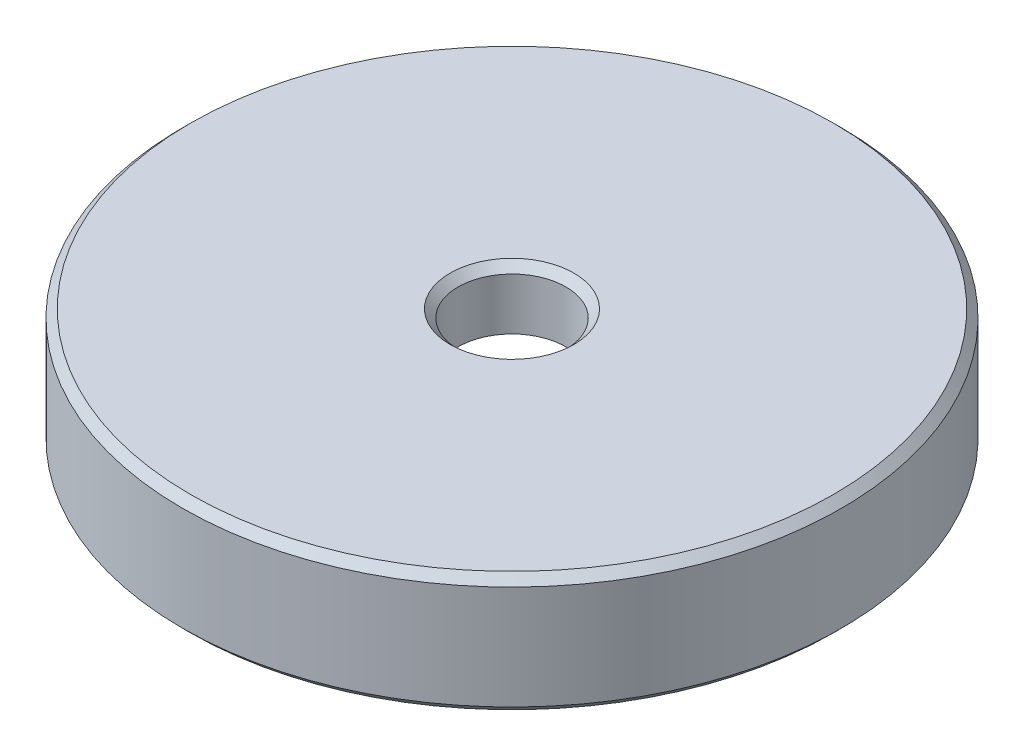
ISO-10303-21;
HEADER;
FILE_DESCRIPTION(('STEP AP214'),'2;1');
FILE_NAME('part.step','',(''),(''),'','','');
FILE_SCHEMA(('AUTOMOTIVE_DESIGN { 1 0 10303 214 1 1 1 1 }'));
ENDSEC;
DATA;
#1=APPLICATION_CONTEXT('core data for automotive mechanical design processes');
#2=APPLICATION_PROTOCOL_DEFINITION('international standard','automotive_design',2000,#1);
#3=PRODUCT_CONTEXT('',#1,'mechanical');
#4=PRODUCT('Part','Part','',(#3));
#5=PRODUCT_RELATED_PRODUCT_CATEGORY('part','',(#4));
#6=PRODUCT_DEFINITION_FORMATION('','',#4);
#7=PRODUCT_DEFINITION_CONTEXT('part definition',#1,'design');
#8=PRODUCT_DEFINITION('design','',#6,#7);
#9=PRODUCT_DEFINITION_SHAPE('','',#8);
#10=(LENGTH_UNIT() NAMED_UNIT(*) SI_UNIT(.MILLI.,.METRE.));
#11=(NAMED_UNIT(*) PLANE_ANGLE_UNIT() SI_UNIT($,.RADIAN.));
#12=(NAMED_UNIT(*) SI_UNIT($,.STERADIAN.) SOLID_ANGLE_UNIT());
#13=UNCERTAINTY_MEASURE_WITH_UNIT(LENGTH_MEASURE(1.E-05),#10,'distance_accuracy_value','');
#14=(GEOMETRIC_REPRESENTATION_CONTEXT(3) GLOBAL_UNCERTAINTY_ASSIGNED_CONTEXT((#13)) GLOBAL_UNIT_ASSIGNED_CONTEXT((#10,
#11,#12)) REPRESENTATION_CONTEXT('',''));
#15=CARTESIAN_POINT('',(0.,0.,0.));
#16=DIRECTION('',(0.,0.,1.));
#17=DIRECTION('',(1.,0.,0.));
#18=AXIS2_PLACEMENT_3D('',#15,#16,#17);
#19=CARTESIAN_POINT('',(0.,0.,0.));
#20=DIRECTION('',(0.,1.,0.));
#21=DIRECTION('',(0.,0.,1.));
#22=AXIS2_PLACEMENT_3D('',#19,#20,#21);
#23=PLANE('',#22);
#24=CARTESIAN_POINT('',(0.,0.,0.));
#25=DIRECTION('',(0.,1.,0.));
#26=DIRECTION('',(0.,0.,1.));
#27=AXIS2_PLACEMENT_3D('',#24,#25,#26);
#28=CIRCLE('',#27,2.7);
#29=CARTESIAN_POINT('',(0.,0.,2.7));
#30=VERTEX_POINT('',#29);
#31=EDGE_CURVE('E69',#30,#30,#28,.T.);
#32=ORIENTED_EDGE('',*,*,#31,.T.);
#33=EDGE_LOOP('',(#32));
#34=FACE_BOUND('',#33,.T.);
#35=CARTESIAN_POINT('',(0.,0.,0.));
#36=DIRECTION('',(0.,1.,0.));
#37=DIRECTION('',(0.,0.,1.));
#38=AXIS2_PLACEMENT_3D('',#35,#36,#37);
#39=CIRCLE('',#38,14.7);
#40=CARTESIAN_POINT('',(0.,0.,14.7));
#41=VERTEX_POINT('',#40);
#42=EDGE_CURVE('E66',#41,#41,#39,.T.);
#43=ORIENTED_EDGE('',*,*,#42,.F.);
#44=EDGE_LOOP('',(#43));
#45=FACE_BOUND('',#44,.T.);
#46=ADVANCED_FACE('F34',(#34,#45),#23,.F.);
#47=CARTESIAN_POINT('',(0.,3.,0.));
#48=DIRECTION('',(0.,-1.,0.));
#49=DIRECTION('',(0.,0.,-1.));
#50=AXIS2_PLACEMENT_3D('',#47,#48,#49);
#51=CYLINDRICAL_SURFACE('',#50,16.5);
#52=CARTESIAN_POINT('',(0.,-2.6,0.));
#53=DIRECTION('',(0.,1.,0.));
#54=DIRECTION('',(0.,0.,1.));
#55=AXIS2_PLACEMENT_3D('',#52,#53,#54);
#56=CIRCLE('',#55,16.5);
#57=CARTESIAN_POINT('',(0.,-2.6,16.5));
#58=VERTEX_POINT('',#57);
#59=EDGE_CURVE('E49',#58,#58,#56,.T.);
#60=ORIENTED_EDGE('',*,*,#59,.T.);
#61=EDGE_LOOP('',(#60));
#62=FACE_BOUND('',#61,.T.);
#63=CARTESIAN_POINT('',(0.,2.6,0.));
#64=DIRECTION('',(0.,1.,0.));
#65=DIRECTION('',(0.,0.,1.));
#66=AXIS2_PLACEMENT_3D('',#63,#64,#65);
#67=CIRCLE('',#66,16.5);
#68=CARTESIAN_POINT('',(0.,2.6,16.5));
#69=VERTEX_POINT('',#68);
#70=EDGE_CURVE('E54',#69,#69,#67,.F.);
#71=ORIENTED_EDGE('',*,*,#70,.T.);
#72=EDGE_LOOP('',(#71));
#73=FACE_BOUND('',#72,.T.);
#74=ADVANCED_FACE('F78',(#62,#73),#51,.T.);
#75=CARTESIAN_POINT('',(0.,3.,0.));
#76=DIRECTION('',(0.,-1.,0.));
#77=DIRECTION('',(0.,0.,-1.));
#78=AXIS2_PLACEMENT_3D('',#75,#76,#77);
#79=CYLINDRICAL_SURFACE('',#78,2.7);
#80=CARTESIAN_POINT('',(0.,2.59999999999999,0.));
#81=DIRECTION('',(0.,1.,0.));
#82=DIRECTION('',(0.,0.,1.));
#83=AXIS2_PLACEMENT_3D('',#80,#81,#82);
#84=CIRCLE('',#83,2.7);
#85=CARTESIAN_POINT('',(0.,2.59999999999999,2.7));
#86=VERTEX_POINT('',#85);
#87=EDGE_CURVE('E10',#86,#86,#84,.T.);
#88=ORIENTED_EDGE('',*,*,#87,.T.);
#89=EDGE_LOOP('',(#88));
#90=FACE_BOUND('',#89,.T.);
#91=ORIENTED_EDGE('',*,*,#31,.F.);
#92=EDGE_LOOP('',(#91));
#93=FACE_BOUND('',#92,.T.);
#94=ADVANCED_FACE('F75',(#90,#93),#79,.F.);
#95=CARTESIAN_POINT('',(0.,3.,0.));
#96=DIRECTION('',(0.,1.,0.));
#97=DIRECTION('',(0.,0.,1.));
#98=AXIS2_PLACEMENT_3D('',#95,#96,#97);
#99=PLANE('',#98);
#100=CARTESIAN_POINT('',(0.,3.,0.));
#101=DIRECTION('',(0.,1.,0.));
#102=DIRECTION('',(0.,0.,1.));
#103=AXIS2_PLACEMENT_3D('',#100,#101,#102);
#104=CIRCLE('',#103,16.1);
#105=CARTESIAN_POINT('',(0.,3.,16.1));
#106=VERTEX_POINT('',#105);
#107=EDGE_CURVE('E41',#106,#106,#104,.T.);
#108=ORIENTED_EDGE('',*,*,#107,.T.);
#109=EDGE_LOOP('',(#108));
#110=FACE_BOUND('',#109,.T.);
#111=CARTESIAN_POINT('',(0.,3.,0.));
#112=DIRECTION('',(0.,1.,0.));
#113=DIRECTION('',(0.,0.,1.));
#114=AXIS2_PLACEMENT_3D('',#111,#112,#113);
#115=CIRCLE('',#114,3.10000000000001);
#116=CARTESIAN_POINT('',(0.,3.,3.10000000000001));
#117=VERTEX_POINT('',#116);
#118=EDGE_CURVE('E45',#117,#117,#115,.F.);
#119=ORIENTED_EDGE('',*,*,#118,.T.);
#120=EDGE_LOOP('',(#119));
#121=FACE_BOUND('',#120,.T.);
#122=ADVANCED_FACE('F77',(#110,#121),#99,.T.);
#123=CARTESIAN_POINT('',(0.,-3.,0.));
#124=DIRECTION('',(0.,1.,0.));
#125=DIRECTION('',(0.,0.,1.));
#126=AXIS2_PLACEMENT_3D('',#123,#124,#125);
#127=CYLINDRICAL_SURFACE('',#126,14.7);
#128=CARTESIAN_POINT('',(0.,-2.6,0.));
#129=DIRECTION('',(0.,1.,0.));
#130=DIRECTION('',(0.,0.,1.));
#131=AXIS2_PLACEMENT_3D('',#128,#129,#130);
#132=CIRCLE('',#131,14.7);
#133=CARTESIAN_POINT('',(0.,-2.6,14.7));
#134=VERTEX_POINT('',#133);
#135=EDGE_CURVE('E57',#134,#134,#132,.F.);
#136=ORIENTED_EDGE('',*,*,#135,.T.);
#137=EDGE_LOOP('',(#136));
#138=FACE_BOUND('',#137,.T.);
#139=ORIENTED_EDGE('',*,*,#42,.T.);
#140=EDGE_LOOP('',(#139));
#141=FACE_BOUND('',#140,.T.);
#142=ADVANCED_FACE('F84',(#138,#141),#127,.F.);
#143=CARTESIAN_POINT('',(0.,-3.,0.));
#144=DIRECTION('',(0.,1.,0.));
#145=DIRECTION('',(0.,0.,1.));
#146=AXIS2_PLACEMENT_3D('',#143,#144,#145);
#147=PLANE('',#146);
#148=CARTESIAN_POINT('',(0.,-3.,0.));
#149=DIRECTION('',(0.,1.,0.));
#150=DIRECTION('',(0.,0.,1.));
#151=AXIS2_PLACEMENT_3D('',#148,#149,#150);
#152=CIRCLE('',#151,15.1);
#153=CARTESIAN_POINT('',(0.,-3.,15.1));
#154=VERTEX_POINT('',#153);
#155=EDGE_CURVE('E60',#154,#154,#152,.T.);
#156=ORIENTED_EDGE('',*,*,#155,.T.);
#157=EDGE_LOOP('',(#156));
#158=FACE_BOUND('',#157,.T.);
#159=CARTESIAN_POINT('',(0.,-3.,0.));
#160=DIRECTION('',(0.,1.,0.));
#161=DIRECTION('',(0.,0.,1.));
#162=AXIS2_PLACEMENT_3D('',#159,#160,#161);
#163=CIRCLE('',#162,16.1);
#164=CARTESIAN_POINT('',(0.,-3.,16.1));
#165=VERTEX_POINT('',#164);
#166=EDGE_CURVE('E63',#165,#165,#163,.F.);
#167=ORIENTED_EDGE('',*,*,#166,.T.);
#168=EDGE_LOOP('',(#167));
#169=FACE_BOUND('',#168,.T.);
#170=ADVANCED_FACE('F95',(#158,#169),#147,.F.);
#171=CARTESIAN_POINT('',(0.,-3.,0.));
#172=DIRECTION('',(0.,-1.,0.));
#173=DIRECTION('',(0.,0.,-1.));
#174=AXIS2_PLACEMENT_3D('',#171,#172,#173);
#175=CONICAL_SURFACE('',#174,15.1,0.785398163397446);
#176=ORIENTED_EDGE('',*,*,#135,.F.);
#177=EDGE_LOOP('',(#176));
#178=FACE_BOUND('',#177,.T.);
#179=ORIENTED_EDGE('',*,*,#155,.F.);
#180=EDGE_LOOP('',(#179));
#181=FACE_BOUND('',#180,.T.);
#182=ADVANCED_FACE('F98',(#178,#181),#175,.F.);
#183=CARTESIAN_POINT('',(0.,-2.6,0.));
#184=DIRECTION('',(0.,1.,0.));
#185=DIRECTION('',(0.,0.,1.));
#186=AXIS2_PLACEMENT_3D('',#183,#184,#185);
#187=CONICAL_SURFACE('',#186,16.5,0.785398163397448);
#188=ORIENTED_EDGE('',*,*,#166,.F.);
#189=EDGE_LOOP('',(#188));
#190=FACE_BOUND('',#189,.T.);
#191=ORIENTED_EDGE('',*,*,#59,.F.);
#192=EDGE_LOOP('',(#191));
#193=FACE_BOUND('',#192,.T.);
#194=ADVANCED_FACE('F103',(#190,#193),#187,.T.);
#195=CARTESIAN_POINT('',(0.,3.,0.));
#196=DIRECTION('',(0.,-1.,0.));
#197=DIRECTION('',(0.,0.,-1.));
#198=AXIS2_PLACEMENT_3D('',#195,#196,#197);
#199=CONICAL_SURFACE('',#198,16.1,0.78539816339744);
#200=ORIENTED_EDGE('',*,*,#70,.F.);
#201=EDGE_LOOP('',(#200));
#202=FACE_BOUND('',#201,.T.);
#203=ORIENTED_EDGE('',*,*,#107,.F.);
#204=EDGE_LOOP('',(#203));
#205=FACE_BOUND('',#204,.T.);
#206=ADVANCED_FACE('F112',(#202,#205),#199,.T.);
#207=CARTESIAN_POINT('',(0.,2.59999999999999,0.));
#208=DIRECTION('',(0.,1.,0.));
#209=DIRECTION('',(0.,0.,1.));
#210=AXIS2_PLACEMENT_3D('',#207,#208,#209);
#211=CONICAL_SURFACE('',#210,2.7,0.785398163397446);
#212=ORIENTED_EDGE('',*,*,#118,.F.);
#213=EDGE_LOOP('',(#212));
#214=FACE_BOUND('',#213,.T.);
#215=ORIENTED_EDGE('',*,*,#87,.F.);
#216=EDGE_LOOP('',(#215));
#217=FACE_BOUND('',#216,.T.);
#218=ADVANCED_FACE('F36',(#214,#217),#211,.F.);
#219=CLOSED_SHELL('',(#46,#74,#94,#122,#142,#170,#182,#194,#206,#218));
#220=MANIFOLD_SOLID_BREP('B2',#219);
#221=ADVANCED_BREP_SHAPE_REPRESENTATION('',(#18,#220),#14);
#222=SHAPE_DEFINITION_REPRESENTATION(#9,#221);
ENDSEC;
END-ISO-10303-21;
